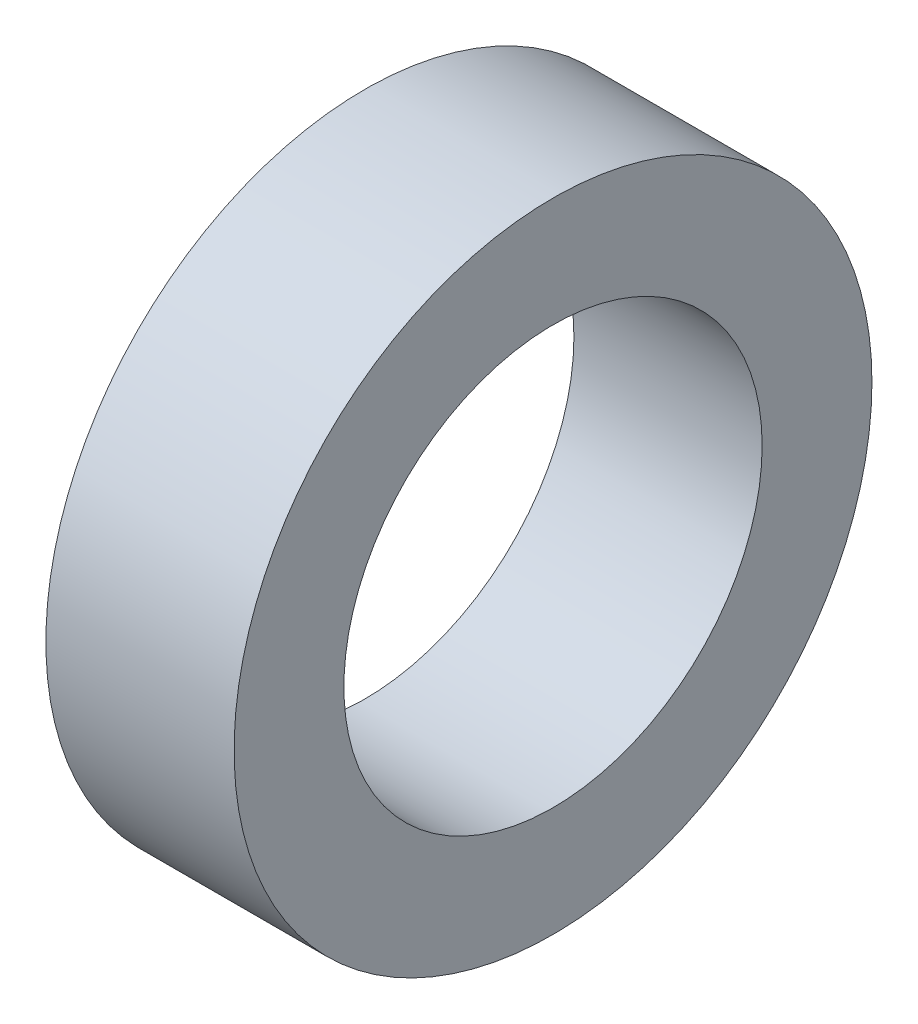
ISO-10303-21;
HEADER;
FILE_DESCRIPTION(('STEP AP214'),'2;1');
FILE_NAME('part.step','',(''),(''),'','','');
FILE_SCHEMA(('AUTOMOTIVE_DESIGN { 1 0 10303 214 1 1 1 1 }'));
ENDSEC;
DATA;
#1=APPLICATION_CONTEXT('core data for automotive mechanical design processes');
#2=APPLICATION_PROTOCOL_DEFINITION('international standard','automotive_design',2000,#1);
#3=PRODUCT_CONTEXT('',#1,'mechanical');
#4=PRODUCT('Part','Part','',(#3));
#5=PRODUCT_RELATED_PRODUCT_CATEGORY('part','',(#4));
#6=PRODUCT_DEFINITION_FORMATION('','',#4);
#7=PRODUCT_DEFINITION_CONTEXT('part definition',#1,'design');
#8=PRODUCT_DEFINITION('design','',#6,#7);
#9=PRODUCT_DEFINITION_SHAPE('','',#8);
#10=(LENGTH_UNIT() NAMED_UNIT(*) SI_UNIT(.MILLI.,.METRE.));
#11=(NAMED_UNIT(*) PLANE_ANGLE_UNIT() SI_UNIT($,.RADIAN.));
#12=(NAMED_UNIT(*) SI_UNIT($,.STERADIAN.) SOLID_ANGLE_UNIT());
#13=UNCERTAINTY_MEASURE_WITH_UNIT(LENGTH_MEASURE(1.E-05),#10,'distance_accuracy_value','');
#14=(GEOMETRIC_REPRESENTATION_CONTEXT(3) GLOBAL_UNCERTAINTY_ASSIGNED_CONTEXT((#13)) GLOBAL_UNIT_ASSIGNED_CONTEXT((#10,
#11,#12)) REPRESENTATION_CONTEXT('',''));
#15=CARTESIAN_POINT('',(0.,0.,0.));
#16=DIRECTION('',(0.,0.,1.));
#17=DIRECTION('',(1.,0.,0.));
#18=AXIS2_PLACEMENT_3D('',#15,#16,#17);
#19=CARTESIAN_POINT('',(3.6,0.,0.));
#20=DIRECTION('',(1.,0.,0.));
#21=DIRECTION('',(0.,0.,-1.));
#22=AXIS2_PLACEMENT_3D('',#19,#20,#21);
#23=PLANE('',#22);
#24=CARTESIAN_POINT('',(3.6,0.,0.));
#25=DIRECTION('',(1.,0.,0.));
#26=DIRECTION('',(0.,0.,-1.));
#27=AXIS2_PLACEMENT_3D('',#24,#25,#26);
#28=CIRCLE('',#27,6.1);
#29=CARTESIAN_POINT('',(3.6,0.,-6.1));
#30=VERTEX_POINT('',#29);
#31=EDGE_CURVE('E11',#30,#30,#28,.T.);
#32=ORIENTED_EDGE('',*,*,#31,.T.);
#33=EDGE_LOOP('',(#32));
#34=FACE_BOUND('',#33,.T.);
#35=CARTESIAN_POINT('',(3.6,0.,0.));
#36=DIRECTION('',(1.,0.,0.));
#37=DIRECTION('',(0.,0.,-1.));
#38=AXIS2_PLACEMENT_3D('',#35,#36,#37);
#39=CIRCLE('',#38,4.);
#40=CARTESIAN_POINT('',(3.6,0.,-4.));
#41=VERTEX_POINT('',#40);
#42=EDGE_CURVE('E54',#41,#41,#39,.T.);
#43=ORIENTED_EDGE('',*,*,#42,.F.);
#44=EDGE_LOOP('',(#43));
#45=FACE_BOUND('',#44,.T.);
#46=ADVANCED_FACE('F43',(#34,#45),#23,.T.);
#47=CARTESIAN_POINT('',(0.,0.,0.));
#48=DIRECTION('',(1.,0.,0.));
#49=DIRECTION('',(0.,0.,-1.));
#50=AXIS2_PLACEMENT_3D('',#47,#48,#49);
#51=PLANE('',#50);
#52=CARTESIAN_POINT('',(0.,0.,0.));
#53=DIRECTION('',(1.,0.,0.));
#54=DIRECTION('',(0.,0.,-1.));
#55=AXIS2_PLACEMENT_3D('',#52,#53,#54);
#56=CIRCLE('',#55,6.1);
#57=CARTESIAN_POINT('',(0.,0.,-6.1));
#58=VERTEX_POINT('',#57);
#59=EDGE_CURVE('E47',#58,#58,#56,.T.);
#60=ORIENTED_EDGE('',*,*,#59,.F.);
#61=EDGE_LOOP('',(#60));
#62=FACE_BOUND('',#61,.T.);
#63=CARTESIAN_POINT('',(0.,0.,0.));
#64=DIRECTION('',(1.,0.,0.));
#65=DIRECTION('',(0.,0.,-1.));
#66=AXIS2_PLACEMENT_3D('',#63,#64,#65);
#67=CIRCLE('',#66,4.);
#68=CARTESIAN_POINT('',(0.,0.,-4.));
#69=VERTEX_POINT('',#68);
#70=EDGE_CURVE('E56',#69,#69,#67,.T.);
#71=ORIENTED_EDGE('',*,*,#70,.T.);
#72=EDGE_LOOP('',(#71));
#73=FACE_BOUND('',#72,.T.);
#74=ADVANCED_FACE('F66',(#62,#73),#51,.F.);
#75=CARTESIAN_POINT('',(3.6,0.,0.));
#76=DIRECTION('',(-1.,0.,0.));
#77=DIRECTION('',(0.,0.,1.));
#78=AXIS2_PLACEMENT_3D('',#75,#76,#77);
#79=CYLINDRICAL_SURFACE('',#78,6.1);
#80=ORIENTED_EDGE('',*,*,#31,.F.);
#81=EDGE_LOOP('',(#80));
#82=FACE_BOUND('',#81,.T.);
#83=ORIENTED_EDGE('',*,*,#59,.T.);
#84=EDGE_LOOP('',(#83));
#85=FACE_BOUND('',#84,.T.);
#86=ADVANCED_FACE('F45',(#82,#85),#79,.T.);
#87=CARTESIAN_POINT('',(3.6,0.,0.));
#88=DIRECTION('',(-1.,0.,0.));
#89=DIRECTION('',(0.,0.,1.));
#90=AXIS2_PLACEMENT_3D('',#87,#88,#89);
#91=CYLINDRICAL_SURFACE('',#90,4.);
#92=ORIENTED_EDGE('',*,*,#42,.T.);
#93=EDGE_LOOP('',(#92));
#94=FACE_BOUND('',#93,.T.);
#95=ORIENTED_EDGE('',*,*,#70,.F.);
#96=EDGE_LOOP('',(#95));
#97=FACE_BOUND('',#96,.T.);
#98=ADVANCED_FACE('F62',(#94,#97),#91,.F.);
#99=CLOSED_SHELL('',(#46,#74,#86,#98));
#100=MANIFOLD_SOLID_BREP('B2',#99);
#101=ADVANCED_BREP_SHAPE_REPRESENTATION('',(#18,#100),#14);
#102=SHAPE_DEFINITION_REPRESENTATION(#9,#101);
ENDSEC;
END-ISO-10303-21;
